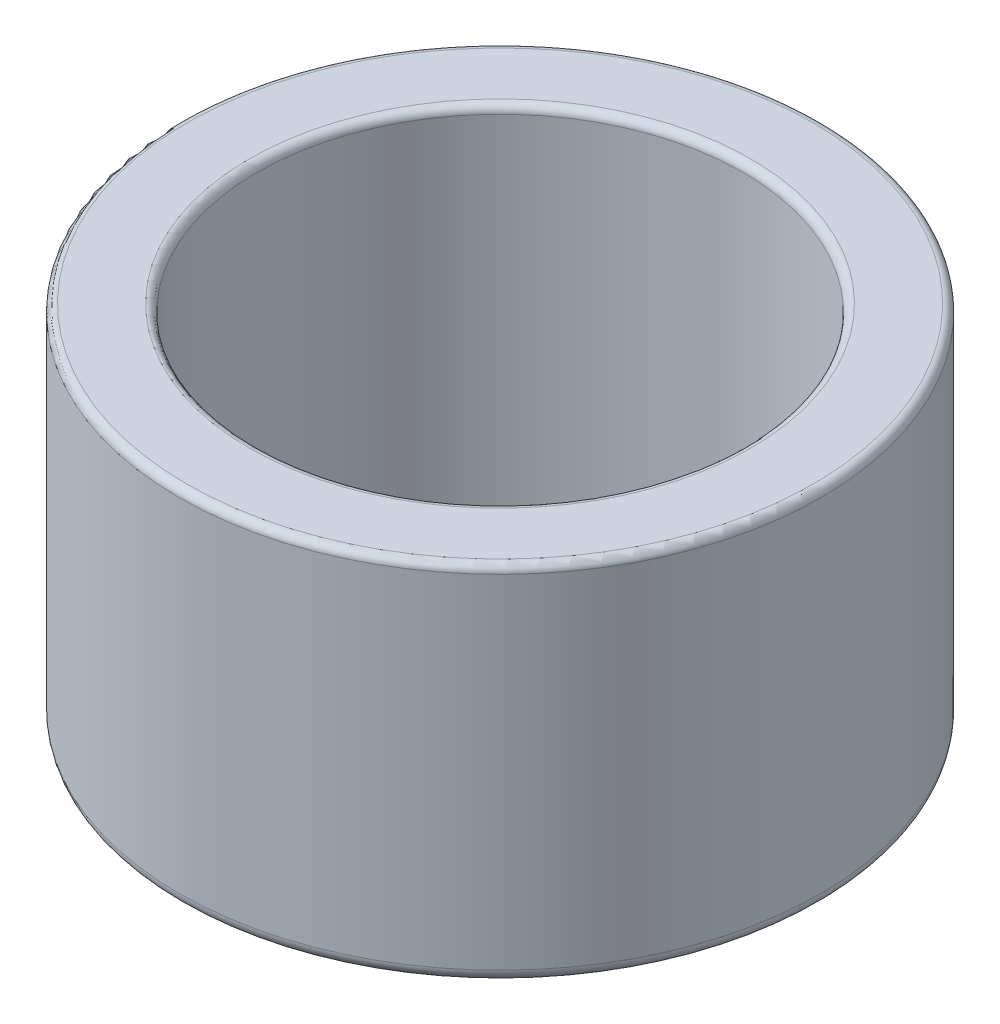
ISO-10303-21;
HEADER;
FILE_DESCRIPTION(('STEP AP214'),'2;1');
FILE_NAME('part.step','',(''),(''),'','','');
FILE_SCHEMA(('AUTOMOTIVE_DESIGN { 1 0 10303 214 1 1 1 1 }'));
ENDSEC;
DATA;
#1=APPLICATION_CONTEXT('core data for automotive mechanical design processes');
#2=APPLICATION_PROTOCOL_DEFINITION('international standard','automotive_design',2000,#1);
#3=PRODUCT_CONTEXT('',#1,'mechanical');
#4=PRODUCT('Part','Part','',(#3));
#5=PRODUCT_RELATED_PRODUCT_CATEGORY('part','',(#4));
#6=PRODUCT_DEFINITION_FORMATION('','',#4);
#7=PRODUCT_DEFINITION_CONTEXT('part definition',#1,'design');
#8=PRODUCT_DEFINITION('design','',#6,#7);
#9=PRODUCT_DEFINITION_SHAPE('','',#8);
#10=(LENGTH_UNIT() NAMED_UNIT(*) SI_UNIT(.MILLI.,.METRE.));
#11=(NAMED_UNIT(*) PLANE_ANGLE_UNIT() SI_UNIT($,.RADIAN.));
#12=(NAMED_UNIT(*) SI_UNIT($,.STERADIAN.) SOLID_ANGLE_UNIT());
#13=UNCERTAINTY_MEASURE_WITH_UNIT(LENGTH_MEASURE(1.E-05),#10,'distance_accuracy_value','');
#14=(GEOMETRIC_REPRESENTATION_CONTEXT(3) GLOBAL_UNCERTAINTY_ASSIGNED_CONTEXT((#13)) GLOBAL_UNIT_ASSIGNED_CONTEXT((#10,
#11,#12)) REPRESENTATION_CONTEXT('',''));
#15=CARTESIAN_POINT('',(0.,0.,0.));
#16=DIRECTION('',(0.,0.,1.));
#17=DIRECTION('',(1.,0.,0.));
#18=AXIS2_PLACEMENT_3D('',#15,#16,#17);
#19=CARTESIAN_POINT('',(0.,14.,0.));
#20=DIRECTION('',(0.,1.,0.));
#21=DIRECTION('',(0.,0.,1.));
#22=AXIS2_PLACEMENT_3D('',#19,#20,#21);
#23=PLANE('',#22);
#24=CARTESIAN_POINT('',(0.,14.,0.));
#25=DIRECTION('',(0.,1.,0.));
#26=DIRECTION('',(0.,0.,1.));
#27=AXIS2_PLACEMENT_3D('',#24,#25,#26);
#28=CIRCLE('',#27,9.65035);
#29=CARTESIAN_POINT('',(0.,14.,9.65035));
#30=VERTEX_POINT('',#29);
#31=EDGE_CURVE('E53',#30,#30,#28,.F.);
#32=ORIENTED_EDGE('',*,*,#31,.T.);
#33=EDGE_LOOP('',(#32));
#34=FACE_BOUND('',#33,.T.);
#35=CARTESIAN_POINT('',(0.,14.,0.));
#36=DIRECTION('',(0.,1.,0.));
#37=DIRECTION('',(0.,0.,1.));
#38=AXIS2_PLACEMENT_3D('',#35,#36,#37);
#39=CIRCLE('',#38,12.05035);
#40=CARTESIAN_POINT('',(0.,14.,12.05035));
#41=VERTEX_POINT('',#40);
#42=EDGE_CURVE('E62',#41,#41,#39,.T.);
#43=ORIENTED_EDGE('',*,*,#42,.T.);
#44=EDGE_LOOP('',(#43));
#45=FACE_BOUND('',#44,.T.);
#46=ADVANCED_FACE('F33',(#34,#45),#23,.T.);
#47=CARTESIAN_POINT('',(0.,0.,0.));
#48=DIRECTION('',(0.,1.,0.));
#49=DIRECTION('',(0.,0.,1.));
#50=AXIS2_PLACEMENT_3D('',#47,#48,#49);
#51=PLANE('',#50);
#52=CARTESIAN_POINT('',(0.,0.,0.));
#53=DIRECTION('',(0.,1.,0.));
#54=DIRECTION('',(0.,0.,1.));
#55=AXIS2_PLACEMENT_3D('',#52,#53,#54);
#56=CIRCLE('',#55,9.85035);
#57=CARTESIAN_POINT('',(0.,0.,9.85035));
#58=VERTEX_POINT('',#57);
#59=EDGE_CURVE('E40',#58,#58,#56,.T.);
#60=ORIENTED_EDGE('',*,*,#59,.T.);
#61=EDGE_LOOP('',(#60));
#62=FACE_BOUND('',#61,.T.);
#63=CARTESIAN_POINT('',(0.,0.,0.));
#64=DIRECTION('',(0.,1.,0.));
#65=DIRECTION('',(0.,0.,1.));
#66=AXIS2_PLACEMENT_3D('',#63,#64,#65);
#67=CIRCLE('',#66,11.85035);
#68=CARTESIAN_POINT('',(0.,0.,11.85035));
#69=VERTEX_POINT('',#68);
#70=EDGE_CURVE('E44',#69,#69,#67,.F.);
#71=ORIENTED_EDGE('',*,*,#70,.T.);
#72=EDGE_LOOP('',(#71));
#73=FACE_BOUND('',#72,.T.);
#74=ADVANCED_FACE('F85',(#62,#73),#51,.F.);
#75=CARTESIAN_POINT('',(0.,14.,0.));
#76=DIRECTION('',(0.,-1.,0.));
#77=DIRECTION('',(0.,0.,-1.));
#78=AXIS2_PLACEMENT_3D('',#75,#76,#77);
#79=CYLINDRICAL_SURFACE('',#78,12.35035);
#80=CARTESIAN_POINT('',(0.,0.5,0.));
#81=DIRECTION('',(0.,1.,0.));
#82=DIRECTION('',(0.,0.,1.));
#83=AXIS2_PLACEMENT_3D('',#80,#81,#82);
#84=CIRCLE('',#83,12.35035);
#85=CARTESIAN_POINT('',(0.,0.5,12.35035));
#86=VERTEX_POINT('',#85);
#87=EDGE_CURVE('E48',#86,#86,#84,.T.);
#88=ORIENTED_EDGE('',*,*,#87,.T.);
#89=EDGE_LOOP('',(#88));
#90=FACE_BOUND('',#89,.T.);
#91=CARTESIAN_POINT('',(0.,13.7,0.));
#92=DIRECTION('',(0.,1.,0.));
#93=DIRECTION('',(0.,0.,1.));
#94=AXIS2_PLACEMENT_3D('',#91,#92,#93);
#95=CIRCLE('',#94,12.35035);
#96=CARTESIAN_POINT('',(0.,13.7,12.35035));
#97=VERTEX_POINT('',#96);
#98=EDGE_CURVE('E59',#97,#97,#95,.F.);
#99=ORIENTED_EDGE('',*,*,#98,.T.);
#100=EDGE_LOOP('',(#99));
#101=FACE_BOUND('',#100,.T.);
#102=ADVANCED_FACE('F80',(#90,#101),#79,.T.);
#103=CARTESIAN_POINT('',(0.,14.,0.));
#104=DIRECTION('',(0.,-1.,0.));
#105=DIRECTION('',(0.,0.,-1.));
#106=AXIS2_PLACEMENT_3D('',#103,#104,#105);
#107=CYLINDRICAL_SURFACE('',#106,9.35035);
#108=CARTESIAN_POINT('',(0.,0.5,0.));
#109=DIRECTION('',(0.,1.,0.));
#110=DIRECTION('',(0.,0.,1.));
#111=AXIS2_PLACEMENT_3D('',#108,#109,#110);
#112=CIRCLE('',#111,9.35035);
#113=CARTESIAN_POINT('',(0.,0.5,9.35035));
#114=VERTEX_POINT('',#113);
#115=EDGE_CURVE('E10',#114,#114,#112,.F.);
#116=ORIENTED_EDGE('',*,*,#115,.T.);
#117=EDGE_LOOP('',(#116));
#118=FACE_BOUND('',#117,.T.);
#119=CARTESIAN_POINT('',(0.,13.7,0.));
#120=DIRECTION('',(0.,1.,0.));
#121=DIRECTION('',(0.,0.,1.));
#122=AXIS2_PLACEMENT_3D('',#119,#120,#121);
#123=CIRCLE('',#122,9.35035);
#124=CARTESIAN_POINT('',(0.,13.7,9.35035));
#125=VERTEX_POINT('',#124);
#126=EDGE_CURVE('E56',#125,#125,#123,.T.);
#127=ORIENTED_EDGE('',*,*,#126,.T.);
#128=EDGE_LOOP('',(#127));
#129=FACE_BOUND('',#128,.T.);
#130=ADVANCED_FACE('F70',(#118,#129),#107,.F.);
#131=CARTESIAN_POINT('',(0.,13.7,0.));
#132=DIRECTION('',(0.,1.,0.));
#133=DIRECTION('',(0.,0.,1.));
#134=AXIS2_PLACEMENT_3D('',#131,#132,#133);
#135=TOROIDAL_SURFACE('',#134,12.05035,0.3);
#136=ORIENTED_EDGE('',*,*,#98,.F.);
#137=EDGE_LOOP('',(#136));
#138=FACE_BOUND('',#137,.T.);
#139=ORIENTED_EDGE('',*,*,#42,.F.);
#140=EDGE_LOOP('',(#139));
#141=FACE_BOUND('',#140,.T.);
#142=ADVANCED_FACE('F67',(#138,#141),#135,.T.);
#143=CARTESIAN_POINT('',(0.,13.7,0.));
#144=DIRECTION('',(0.,1.,0.));
#145=DIRECTION('',(0.,0.,1.));
#146=AXIS2_PLACEMENT_3D('',#143,#144,#145);
#147=TOROIDAL_SURFACE('',#146,9.65035,0.3);
#148=ORIENTED_EDGE('',*,*,#31,.F.);
#149=EDGE_LOOP('',(#148));
#150=FACE_BOUND('',#149,.T.);
#151=ORIENTED_EDGE('',*,*,#126,.F.);
#152=EDGE_LOOP('',(#151));
#153=FACE_BOUND('',#152,.T.);
#154=ADVANCED_FACE('F69',(#150,#153),#147,.T.);
#155=CARTESIAN_POINT('',(0.,0.5,0.));
#156=DIRECTION('',(0.,1.,0.));
#157=DIRECTION('',(0.,0.,1.));
#158=AXIS2_PLACEMENT_3D('',#155,#156,#157);
#159=TOROIDAL_SURFACE('',#158,11.85035,0.5);
#160=ORIENTED_EDGE('',*,*,#70,.F.);
#161=EDGE_LOOP('',(#160));
#162=FACE_BOUND('',#161,.T.);
#163=ORIENTED_EDGE('',*,*,#87,.F.);
#164=EDGE_LOOP('',(#163));
#165=FACE_BOUND('',#164,.T.);
#166=ADVANCED_FACE('F77',(#162,#165),#159,.T.);
#167=CARTESIAN_POINT('',(0.,0.5,0.));
#168=DIRECTION('',(0.,1.,0.));
#169=DIRECTION('',(0.,0.,1.));
#170=AXIS2_PLACEMENT_3D('',#167,#168,#169);
#171=TOROIDAL_SURFACE('',#170,9.85035,0.5);
#172=ORIENTED_EDGE('',*,*,#115,.F.);
#173=EDGE_LOOP('',(#172));
#174=FACE_BOUND('',#173,.T.);
#175=ORIENTED_EDGE('',*,*,#59,.F.);
#176=EDGE_LOOP('',(#175));
#177=FACE_BOUND('',#176,.T.);
#178=ADVANCED_FACE('F35',(#174,#177),#171,.T.);
#179=CLOSED_SHELL('',(#46,#74,#102,#130,#142,#154,#166,#178));
#180=MANIFOLD_SOLID_BREP('B2',#179);
#181=ADVANCED_BREP_SHAPE_REPRESENTATION('',(#18,#180),#14);
#182=SHAPE_DEFINITION_REPRESENTATION(#9,#181);
ENDSEC;
END-ISO-10303-21;
